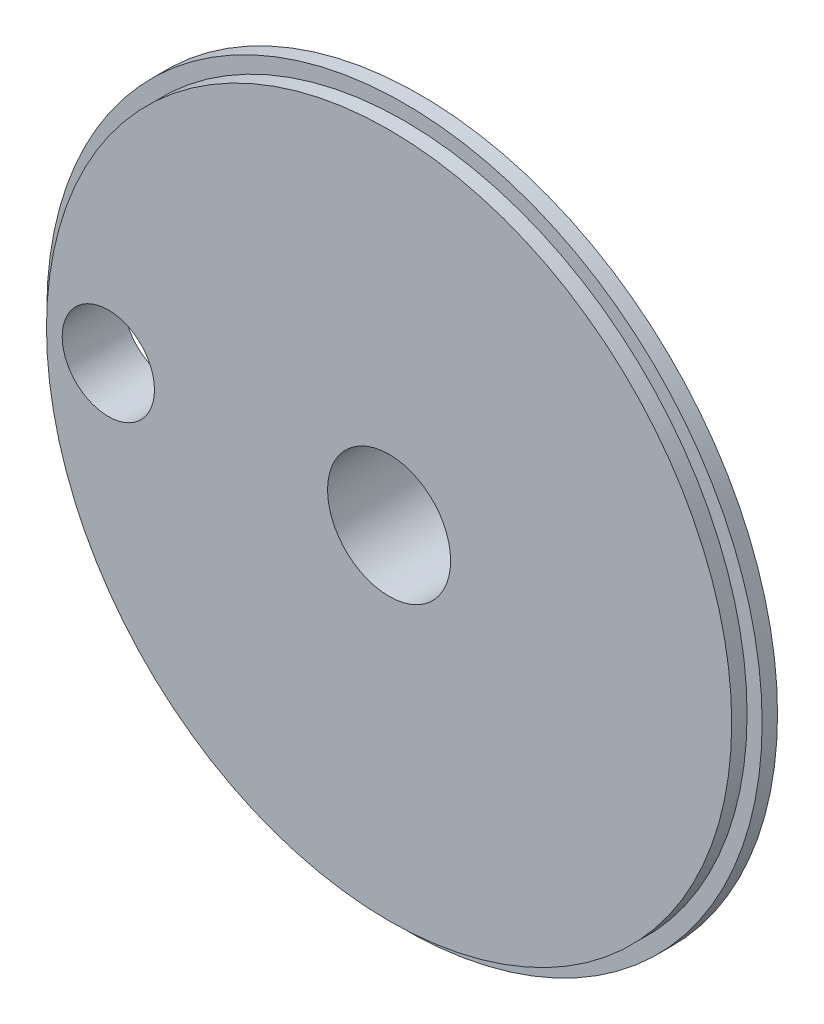
ISO-10303-21;
HEADER;
FILE_DESCRIPTION(('STEP AP214'),'2;1');
FILE_NAME('part.step','',(''),(''),'','','');
FILE_SCHEMA(('AUTOMOTIVE_DESIGN { 1 0 10303 214 1 1 1 1 }'));
ENDSEC;
DATA;
#1=APPLICATION_CONTEXT('core data for automotive mechanical design processes');
#2=APPLICATION_PROTOCOL_DEFINITION('international standard','automotive_design',2000,#1);
#3=PRODUCT_CONTEXT('',#1,'mechanical');
#4=PRODUCT('Part','Part','',(#3));
#5=PRODUCT_RELATED_PRODUCT_CATEGORY('part','',(#4));
#6=PRODUCT_DEFINITION_FORMATION('','',#4);
#7=PRODUCT_DEFINITION_CONTEXT('part definition',#1,'design');
#8=PRODUCT_DEFINITION('design','',#6,#7);
#9=PRODUCT_DEFINITION_SHAPE('','',#8);
#10=(LENGTH_UNIT() NAMED_UNIT(*) SI_UNIT(.MILLI.,.METRE.));
#11=(NAMED_UNIT(*) PLANE_ANGLE_UNIT() SI_UNIT($,.RADIAN.));
#12=(NAMED_UNIT(*) SI_UNIT($,.STERADIAN.) SOLID_ANGLE_UNIT());
#13=UNCERTAINTY_MEASURE_WITH_UNIT(LENGTH_MEASURE(1.E-05),#10,'distance_accuracy_value','');
#14=(GEOMETRIC_REPRESENTATION_CONTEXT(3) GLOBAL_UNCERTAINTY_ASSIGNED_CONTEXT((#13)) GLOBAL_UNIT_ASSIGNED_CONTEXT((#10,
#11,#12)) REPRESENTATION_CONTEXT('',''));
#15=CARTESIAN_POINT('',(0.,0.,0.));
#16=DIRECTION('',(0.,0.,1.));
#17=DIRECTION('',(1.,0.,0.));
#18=AXIS2_PLACEMENT_3D('',#15,#16,#17);
#19=CARTESIAN_POINT('',(0.,0.,2.));
#20=DIRECTION('',(0.,0.,1.));
#21=DIRECTION('',(1.,0.,0.));
#22=AXIS2_PLACEMENT_3D('',#19,#20,#21);
#23=PLANE('',#22);
#24=CARTESIAN_POINT('',(0.,0.,2.));
#25=DIRECTION('',(0.,0.,1.));
#26=DIRECTION('',(1.,0.,0.));
#27=AXIS2_PLACEMENT_3D('',#24,#25,#26);
#28=CIRCLE('',#27,44.54241888858);
#29=CARTESIAN_POINT('',(44.54241888858,0.,2.));
#30=VERTEX_POINT('',#29);
#31=EDGE_CURVE('E52',#30,#30,#28,.T.);
#32=ORIENTED_EDGE('',*,*,#31,.F.);
#33=EDGE_LOOP('',(#32));
#34=FACE_BOUND('',#33,.T.);
#35=CARTESIAN_POINT('',(0.,0.,2.));
#36=DIRECTION('',(0.,0.,1.));
#37=DIRECTION('',(1.,0.,0.));
#38=AXIS2_PLACEMENT_3D('',#35,#36,#37);
#39=CIRCLE('',#38,46.5);
#40=CARTESIAN_POINT('',(46.5,0.,2.));
#41=VERTEX_POINT('',#40);
#42=EDGE_CURVE('E56',#41,#41,#39,.T.);
#43=ORIENTED_EDGE('',*,*,#42,.T.);
#44=EDGE_LOOP('',(#43));
#45=FACE_BOUND('',#44,.T.);
#46=ADVANCED_FACE('F41',(#34,#45),#23,.T.);
#47=CARTESIAN_POINT('',(0.,0.,0.));
#48=DIRECTION('',(0.,0.,1.));
#49=DIRECTION('',(1.,0.,0.));
#50=AXIS2_PLACEMENT_3D('',#47,#48,#49);
#51=PLANE('',#50);
#52=CARTESIAN_POINT('',(-36.5,0.,0.));
#53=DIRECTION('',(0.,0.,1.));
#54=DIRECTION('',(1.,0.,0.));
#55=AXIS2_PLACEMENT_3D('',#52,#53,#54);
#56=CIRCLE('',#55,8.);
#57=CARTESIAN_POINT('',(-28.5,0.,0.));
#58=VERTEX_POINT('',#57);
#59=EDGE_CURVE('E10',#58,#58,#56,.F.);
#60=ORIENTED_EDGE('',*,*,#59,.F.);
#61=EDGE_LOOP('',(#60));
#62=FACE_BOUND('',#61,.T.);
#63=CARTESIAN_POINT('',(0.,0.,0.));
#64=DIRECTION('',(0.,0.,1.));
#65=DIRECTION('',(1.,0.,0.));
#66=AXIS2_PLACEMENT_3D('',#63,#64,#65);
#67=CIRCLE('',#66,10.);
#68=CARTESIAN_POINT('',(10.,0.,0.));
#69=VERTEX_POINT('',#68);
#70=EDGE_CURVE('E48',#69,#69,#67,.F.);
#71=ORIENTED_EDGE('',*,*,#70,.F.);
#72=EDGE_LOOP('',(#71));
#73=FACE_BOUND('',#72,.T.);
#74=CARTESIAN_POINT('',(0.,0.,0.));
#75=DIRECTION('',(0.,0.,1.));
#76=DIRECTION('',(1.,0.,0.));
#77=AXIS2_PLACEMENT_3D('',#74,#75,#76);
#78=CIRCLE('',#77,46.5);
#79=CARTESIAN_POINT('',(46.5,0.,0.));
#80=VERTEX_POINT('',#79);
#81=EDGE_CURVE('E59',#80,#80,#78,.T.);
#82=ORIENTED_EDGE('',*,*,#81,.F.);
#83=EDGE_LOOP('',(#82));
#84=FACE_BOUND('',#83,.T.);
#85=ADVANCED_FACE('F106',(#62,#73,#84),#51,.F.);
#86=CARTESIAN_POINT('',(0.,0.,2.));
#87=DIRECTION('',(0.,0.,-1.));
#88=DIRECTION('',(-1.,0.,0.));
#89=AXIS2_PLACEMENT_3D('',#86,#87,#88);
#90=CYLINDRICAL_SURFACE('',#89,46.5);
#91=ORIENTED_EDGE('',*,*,#42,.F.);
#92=EDGE_LOOP('',(#91));
#93=FACE_BOUND('',#92,.T.);
#94=ORIENTED_EDGE('',*,*,#81,.T.);
#95=EDGE_LOOP('',(#94));
#96=FACE_BOUND('',#95,.T.);
#97=ADVANCED_FACE('F43',(#93,#96),#90,.T.);
#98=CARTESIAN_POINT('',(0.,0.,2.));
#99=DIRECTION('',(0.,0.,-1.));
#100=DIRECTION('',(-1.,0.,0.));
#101=AXIS2_PLACEMENT_3D('',#98,#99,#100);
#102=CYLINDRICAL_SURFACE('',#101,8.);
#103=CARTESIAN_POINT('',(0.,0.,4.));
#104=DIRECTION('',(0.,0.,1.));
#105=DIRECTION('',(1.,0.,0.));
#106=AXIS2_PLACEMENT_3D('',#103,#104,#105);
#107=CIRCLE('',#106,8.);
#108=CARTESIAN_POINT('',(8.,0.,4.));
#109=VERTEX_POINT('',#108);
#110=EDGE_CURVE('E67',#109,#109,#107,.T.);
#111=ORIENTED_EDGE('',*,*,#110,.T.);
#112=EDGE_LOOP('',(#111));
#113=FACE_BOUND('',#112,.T.);
#114=CARTESIAN_POINT('',(0.,0.,-8.));
#115=DIRECTION('',(0.,0.,-1.));
#116=DIRECTION('',(-1.,0.,0.));
#117=AXIS2_PLACEMENT_3D('',#114,#115,#116);
#118=CIRCLE('',#117,8.);
#119=CARTESIAN_POINT('',(-8.,0.,-8.));
#120=VERTEX_POINT('',#119);
#121=EDGE_CURVE('E76',#120,#120,#118,.F.);
#122=ORIENTED_EDGE('',*,*,#121,.F.);
#123=EDGE_LOOP('',(#122));
#124=FACE_BOUND('',#123,.T.);
#125=ADVANCED_FACE('F92',(#113,#124),#102,.F.);
#126=CARTESIAN_POINT('',(-36.5,0.,2.));
#127=DIRECTION('',(0.,0.,-1.));
#128=DIRECTION('',(-1.,0.,0.));
#129=AXIS2_PLACEMENT_3D('',#126,#127,#128);
#130=CYLINDRICAL_SURFACE('',#129,6.);
#131=CARTESIAN_POINT('',(-36.5,0.,4.));
#132=DIRECTION('',(0.,0.,1.));
#133=DIRECTION('',(1.,0.,0.));
#134=AXIS2_PLACEMENT_3D('',#131,#132,#133);
#135=CIRCLE('',#134,6.);
#136=CARTESIAN_POINT('',(-30.5,0.,4.));
#137=VERTEX_POINT('',#136);
#138=EDGE_CURVE('E70',#137,#137,#135,.T.);
#139=ORIENTED_EDGE('',*,*,#138,.T.);
#140=EDGE_LOOP('',(#139));
#141=FACE_BOUND('',#140,.T.);
#142=CARTESIAN_POINT('',(-36.5,0.,-4.));
#143=DIRECTION('',(0.,0.,-1.));
#144=DIRECTION('',(-1.,0.,0.));
#145=AXIS2_PLACEMENT_3D('',#142,#143,#144);
#146=CIRCLE('',#145,6.);
#147=CARTESIAN_POINT('',(-42.5,0.,-4.));
#148=VERTEX_POINT('',#147);
#149=EDGE_CURVE('E82',#148,#148,#146,.F.);
#150=ORIENTED_EDGE('',*,*,#149,.F.);
#151=EDGE_LOOP('',(#150));
#152=FACE_BOUND('',#151,.T.);
#153=ADVANCED_FACE('F89',(#141,#152),#130,.F.);
#154=CARTESIAN_POINT('',(0.,0.,4.));
#155=DIRECTION('',(0.,0.,1.));
#156=DIRECTION('',(1.,0.,0.));
#157=AXIS2_PLACEMENT_3D('',#154,#155,#156);
#158=PLANE('',#157);
#159=ORIENTED_EDGE('',*,*,#110,.F.);
#160=EDGE_LOOP('',(#159));
#161=FACE_BOUND('',#160,.T.);
#162=CARTESIAN_POINT('',(0.,0.,4.));
#163=DIRECTION('',(0.,0.,1.));
#164=DIRECTION('',(1.,0.,0.));
#165=AXIS2_PLACEMENT_3D('',#162,#163,#164);
#166=CIRCLE('',#165,44.54241888858);
#167=CARTESIAN_POINT('',(44.54241888858,0.,4.));
#168=VERTEX_POINT('',#167);
#169=EDGE_CURVE('E62',#168,#168,#166,.T.);
#170=ORIENTED_EDGE('',*,*,#169,.T.);
#171=EDGE_LOOP('',(#170));
#172=FACE_BOUND('',#171,.T.);
#173=ORIENTED_EDGE('',*,*,#138,.F.);
#174=EDGE_LOOP('',(#173));
#175=FACE_BOUND('',#174,.T.);
#176=ADVANCED_FACE('F91',(#161,#172,#175),#158,.T.);
#177=CARTESIAN_POINT('',(0.,0.,4.));
#178=DIRECTION('',(0.,0.,-1.));
#179=DIRECTION('',(-1.,0.,0.));
#180=AXIS2_PLACEMENT_3D('',#177,#178,#179);
#181=CYLINDRICAL_SURFACE('',#180,44.54241888858);
#182=ORIENTED_EDGE('',*,*,#169,.F.);
#183=EDGE_LOOP('',(#182));
#184=FACE_BOUND('',#183,.T.);
#185=ORIENTED_EDGE('',*,*,#31,.T.);
#186=EDGE_LOOP('',(#185));
#187=FACE_BOUND('',#186,.T.);
#188=ADVANCED_FACE('F99',(#184,#187),#181,.T.);
#189=CARTESIAN_POINT('',(0.,0.,-8.));
#190=DIRECTION('',(0.,0.,1.));
#191=DIRECTION('',(1.,0.,0.));
#192=AXIS2_PLACEMENT_3D('',#189,#190,#191);
#193=CYLINDRICAL_SURFACE('',#192,10.);
#194=CARTESIAN_POINT('',(0.,0.,-8.));
#195=DIRECTION('',(0.,0.,-1.));
#196=DIRECTION('',(-1.,0.,0.));
#197=AXIS2_PLACEMENT_3D('',#194,#195,#196);
#198=CIRCLE('',#197,10.);
#199=CARTESIAN_POINT('',(-10.,0.,-8.));
#200=VERTEX_POINT('',#199);
#201=EDGE_CURVE('E73',#200,#200,#198,.T.);
#202=ORIENTED_EDGE('',*,*,#201,.F.);
#203=EDGE_LOOP('',(#202));
#204=FACE_BOUND('',#203,.T.);
#205=ORIENTED_EDGE('',*,*,#70,.T.);
#206=EDGE_LOOP('',(#205));
#207=FACE_BOUND('',#206,.T.);
#208=ADVANCED_FACE('F141',(#204,#207),#193,.T.);
#209=CARTESIAN_POINT('',(0.,0.,-8.));
#210=DIRECTION('',(0.,0.,-1.));
#211=DIRECTION('',(-1.,0.,0.));
#212=AXIS2_PLACEMENT_3D('',#209,#210,#211);
#213=PLANE('',#212);
#214=ORIENTED_EDGE('',*,*,#121,.T.);
#215=EDGE_LOOP('',(#214));
#216=FACE_BOUND('',#215,.T.);
#217=ORIENTED_EDGE('',*,*,#201,.T.);
#218=EDGE_LOOP('',(#217));
#219=FACE_BOUND('',#218,.T.);
#220=ADVANCED_FACE('F145',(#216,#219),#213,.T.);
#221=CARTESIAN_POINT('',(-36.5,0.,-4.));
#222=DIRECTION('',(0.,0.,1.));
#223=DIRECTION('',(1.,0.,0.));
#224=AXIS2_PLACEMENT_3D('',#221,#222,#223);
#225=CYLINDRICAL_SURFACE('',#224,8.);
#226=CARTESIAN_POINT('',(-36.5,0.,-4.));
#227=DIRECTION('',(0.,0.,-1.));
#228=DIRECTION('',(-1.,0.,0.));
#229=AXIS2_PLACEMENT_3D('',#226,#227,#228);
#230=CIRCLE('',#229,8.);
#231=CARTESIAN_POINT('',(-44.5,0.,-4.));
#232=VERTEX_POINT('',#231);
#233=EDGE_CURVE('E79',#232,#232,#230,.T.);
#234=ORIENTED_EDGE('',*,*,#233,.F.);
#235=EDGE_LOOP('',(#234));
#236=FACE_BOUND('',#235,.T.);
#237=ORIENTED_EDGE('',*,*,#59,.T.);
#238=EDGE_LOOP('',(#237));
#239=FACE_BOUND('',#238,.T.);
#240=ADVANCED_FACE('F155',(#236,#239),#225,.T.);
#241=CARTESIAN_POINT('',(0.,0.,-4.));
#242=DIRECTION('',(0.,0.,-1.));
#243=DIRECTION('',(-1.,0.,0.));
#244=AXIS2_PLACEMENT_3D('',#241,#242,#243);
#245=PLANE('',#244);
#246=ORIENTED_EDGE('',*,*,#149,.T.);
#247=EDGE_LOOP('',(#246));
#248=FACE_BOUND('',#247,.T.);
#249=ORIENTED_EDGE('',*,*,#233,.T.);
#250=EDGE_LOOP('',(#249));
#251=FACE_BOUND('',#250,.T.);
#252=ADVANCED_FACE('F86',(#248,#251),#245,.T.);
#253=CLOSED_SHELL('',(#46,#85,#97,#125,#153,#176,#188,#208,#220,#240,#252));
#254=MANIFOLD_SOLID_BREP('B2',#253);
#255=ADVANCED_BREP_SHAPE_REPRESENTATION('',(#18,#254),#14);
#256=SHAPE_DEFINITION_REPRESENTATION(#9,#255);
ENDSEC;
END-ISO-10303-21;
